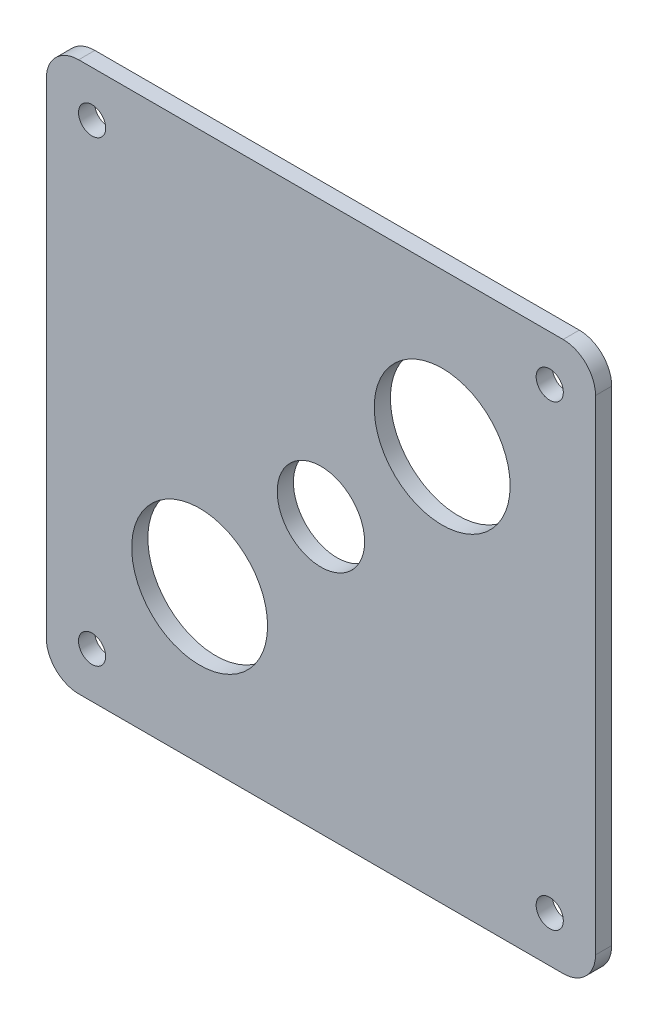
ISO-10303-21;
HEADER;
FILE_DESCRIPTION(('STEP AP214'),'2;1');
FILE_NAME('part.step','',(''),(''),'','','');
FILE_SCHEMA(('AUTOMOTIVE_DESIGN { 1 0 10303 214 1 1 1 1 }'));
ENDSEC;
DATA;
#1=APPLICATION_CONTEXT('core data for automotive mechanical design processes');
#2=APPLICATION_PROTOCOL_DEFINITION('international standard','automotive_design',2000,#1);
#3=PRODUCT_CONTEXT('',#1,'mechanical');
#4=PRODUCT('Part','Part','',(#3));
#5=PRODUCT_RELATED_PRODUCT_CATEGORY('part','',(#4));
#6=PRODUCT_DEFINITION_FORMATION('','',#4);
#7=PRODUCT_DEFINITION_CONTEXT('part definition',#1,'design');
#8=PRODUCT_DEFINITION('design','',#6,#7);
#9=PRODUCT_DEFINITION_SHAPE('','',#8);
#10=(LENGTH_UNIT() NAMED_UNIT(*) SI_UNIT(.MILLI.,.METRE.));
#11=(NAMED_UNIT(*) PLANE_ANGLE_UNIT() SI_UNIT($,.RADIAN.));
#12=(NAMED_UNIT(*) SI_UNIT($,.STERADIAN.) SOLID_ANGLE_UNIT());
#13=UNCERTAINTY_MEASURE_WITH_UNIT(LENGTH_MEASURE(1.E-05),#10,'distance_accuracy_value','');
#14=(GEOMETRIC_REPRESENTATION_CONTEXT(3) GLOBAL_UNCERTAINTY_ASSIGNED_CONTEXT((#13)) GLOBAL_UNIT_ASSIGNED_CONTEXT((#10,
#11,#12)) REPRESENTATION_CONTEXT('',''));
#15=CARTESIAN_POINT('',(0.,0.,0.));
#16=DIRECTION('',(0.,0.,1.));
#17=DIRECTION('',(1.,0.,0.));
#18=AXIS2_PLACEMENT_3D('',#15,#16,#17);
#19=CARTESIAN_POINT('',(-53.8815367264149,-53.8815367264149,3.175));
#20=DIRECTION('',(0.,1.,0.));
#21=DIRECTION('',(0.,0.,1.));
#22=AXIS2_PLACEMENT_3D('',#19,#20,#21);
#23=PLANE('',#22);
#24=DIRECTION('',(1.,0.,0.));
#25=VECTOR('',#24,1.);
#26=CARTESIAN_POINT('',(-53.8815367264149,-53.8815367264149,0.));
#27=LINE('',#26,#25);
#28=CARTESIAN_POINT('',(-47.5315367264149,-53.8815367264149,0.));
#29=VERTEX_POINT('',#28);
#30=CARTESIAN_POINT('',(47.5315367264149,-53.8815367264149,0.));
#31=VERTEX_POINT('',#30);
#32=EDGE_CURVE('E186',#29,#31,#27,.T.);
#33=ORIENTED_EDGE('',*,*,#32,.T.);
#34=DIRECTION('',(0.,0.,-1.));
#35=VECTOR('',#34,1.);
#36=CARTESIAN_POINT('',(47.5315367264149,-53.8815367264149,3.175));
#37=LINE('',#36,#35);
#38=CARTESIAN_POINT('',(47.5315367264149,-53.8815367264149,3.175));
#39=VERTEX_POINT('',#38);
#40=EDGE_CURVE('E11',#31,#39,#37,.F.);
#41=ORIENTED_EDGE('',*,*,#40,.T.);
#42=DIRECTION('',(1.,0.,0.));
#43=VECTOR('',#42,1.);
#44=CARTESIAN_POINT('',(-53.8815367264149,-53.8815367264149,3.175));
#45=LINE('',#44,#43);
#46=CARTESIAN_POINT('',(-47.5315367264149,-53.8815367264149,3.175));
#47=VERTEX_POINT('',#46);
#48=EDGE_CURVE('E189',#47,#39,#45,.T.);
#49=ORIENTED_EDGE('',*,*,#48,.F.);
#50=DIRECTION('',(0.,0.,-1.));
#51=VECTOR('',#50,1.);
#52=CARTESIAN_POINT('',(-47.5315367264149,-53.8815367264149,0.));
#53=LINE('',#52,#51);
#54=EDGE_CURVE('E50',#47,#29,#53,.T.);
#55=ORIENTED_EDGE('',*,*,#54,.T.);
#56=EDGE_LOOP('',(#33,#41,#49,#55));
#57=FACE_BOUND('',#56,.T.);
#58=ADVANCED_FACE('F41',(#57),#23,.F.);
#59=CARTESIAN_POINT('',(53.8815367264149,-53.8815367264149,3.175));
#60=DIRECTION('',(-1.,0.,0.));
#61=DIRECTION('',(0.,0.,1.));
#62=AXIS2_PLACEMENT_3D('',#59,#60,#61);
#63=PLANE('',#62);
#64=DIRECTION('',(0.,1.,0.));
#65=VECTOR('',#64,1.);
#66=CARTESIAN_POINT('',(53.8815367264149,-53.8815367264149,0.));
#67=LINE('',#66,#65);
#68=CARTESIAN_POINT('',(53.8815367264149,-47.5315367264149,0.));
#69=VERTEX_POINT('',#68);
#70=CARTESIAN_POINT('',(53.8815367264149,47.5315367264149,0.));
#71=VERTEX_POINT('',#70);
#72=EDGE_CURVE('E139',#69,#71,#67,.T.);
#73=ORIENTED_EDGE('',*,*,#72,.T.);
#74=DIRECTION('',(0.,0.,-1.));
#75=VECTOR('',#74,1.);
#76=CARTESIAN_POINT('',(53.8815367264149,47.5315367264149,3.175));
#77=LINE('',#76,#75);
#78=CARTESIAN_POINT('',(53.8815367264149,47.5315367264149,3.175));
#79=VERTEX_POINT('',#78);
#80=EDGE_CURVE('E162',#71,#79,#77,.F.);
#81=ORIENTED_EDGE('',*,*,#80,.T.);
#82=DIRECTION('',(0.,1.,0.));
#83=VECTOR('',#82,1.);
#84=CARTESIAN_POINT('',(53.8815367264149,-53.8815367264149,3.175));
#85=LINE('',#84,#83);
#86=CARTESIAN_POINT('',(53.8815367264149,-47.5315367264149,3.175));
#87=VERTEX_POINT('',#86);
#88=EDGE_CURVE('E208',#87,#79,#85,.T.);
#89=ORIENTED_EDGE('',*,*,#88,.F.);
#90=DIRECTION('',(0.,0.,-1.));
#91=VECTOR('',#90,1.);
#92=CARTESIAN_POINT('',(53.8815367264149,-47.5315367264149,3.175));
#93=LINE('',#92,#91);
#94=EDGE_CURVE('E159',#87,#69,#93,.T.);
#95=ORIENTED_EDGE('',*,*,#94,.T.);
#96=EDGE_LOOP('',(#73,#81,#89,#95));
#97=FACE_BOUND('',#96,.T.);
#98=ADVANCED_FACE('F290',(#97),#63,.F.);
#99=CARTESIAN_POINT('',(-53.8815367264149,53.8815367264149,3.175));
#100=DIRECTION('',(0.,1.,0.));
#101=DIRECTION('',(0.,0.,1.));
#102=AXIS2_PLACEMENT_3D('',#99,#100,#101);
#103=PLANE('',#102);
#104=DIRECTION('',(1.,0.,0.));
#105=VECTOR('',#104,1.);
#106=CARTESIAN_POINT('',(-53.8815367264149,53.8815367264149,3.175));
#107=LINE('',#106,#105);
#108=CARTESIAN_POINT('',(-47.5315367264149,53.8815367264149,3.175));
#109=VERTEX_POINT('',#108);
#110=CARTESIAN_POINT('',(47.5315367264149,53.8815367264149,3.175));
#111=VERTEX_POINT('',#110);
#112=EDGE_CURVE('E149',#109,#111,#107,.T.);
#113=ORIENTED_EDGE('',*,*,#112,.T.);
#114=DIRECTION('',(0.,0.,-1.));
#115=VECTOR('',#114,1.);
#116=CARTESIAN_POINT('',(47.5315367264149,53.8815367264149,0.));
#117=LINE('',#116,#115);
#118=CARTESIAN_POINT('',(47.5315367264149,53.8815367264149,0.));
#119=VERTEX_POINT('',#118);
#120=EDGE_CURVE('E137',#111,#119,#117,.T.);
#121=ORIENTED_EDGE('',*,*,#120,.T.);
#122=DIRECTION('',(1.,0.,0.));
#123=VECTOR('',#122,1.);
#124=CARTESIAN_POINT('',(-53.8815367264149,53.8815367264149,0.));
#125=LINE('',#124,#123);
#126=CARTESIAN_POINT('',(-47.5315367264149,53.8815367264149,0.));
#127=VERTEX_POINT('',#126);
#128=EDGE_CURVE('E121',#127,#119,#125,.T.);
#129=ORIENTED_EDGE('',*,*,#128,.F.);
#130=DIRECTION('',(0.,0.,-1.));
#131=VECTOR('',#130,1.);
#132=CARTESIAN_POINT('',(-47.5315367264149,53.8815367264149,3.175));
#133=LINE('',#132,#131);
#134=EDGE_CURVE('E135',#127,#109,#133,.F.);
#135=ORIENTED_EDGE('',*,*,#134,.T.);
#136=EDGE_LOOP('',(#113,#121,#129,#135));
#137=FACE_BOUND('',#136,.T.);
#138=ADVANCED_FACE('F134',(#137),#103,.T.);
#139=CARTESIAN_POINT('',(-53.8815367264149,-53.8815367264149,3.175));
#140=DIRECTION('',(-1.,0.,0.));
#141=DIRECTION('',(0.,0.,1.));
#142=AXIS2_PLACEMENT_3D('',#139,#140,#141);
#143=PLANE('',#142);
#144=DIRECTION('',(0.,1.,0.));
#145=VECTOR('',#144,1.);
#146=CARTESIAN_POINT('',(-53.8815367264149,-53.8815367264149,3.175));
#147=LINE('',#146,#145);
#148=CARTESIAN_POINT('',(-53.8815367264149,-47.5315367264149,3.175));
#149=VERTEX_POINT('',#148);
#150=CARTESIAN_POINT('',(-53.8815367264149,47.5315367264149,3.175));
#151=VERTEX_POINT('',#150);
#152=EDGE_CURVE('E143',#149,#151,#147,.T.);
#153=ORIENTED_EDGE('',*,*,#152,.T.);
#154=DIRECTION('',(0.,0.,-1.));
#155=VECTOR('',#154,1.);
#156=CARTESIAN_POINT('',(-53.8815367264149,47.5315367264149,3.175));
#157=LINE('',#156,#155);
#158=CARTESIAN_POINT('',(-53.8815367264149,47.5315367264149,0.));
#159=VERTEX_POINT('',#158);
#160=EDGE_CURVE('E176',#151,#159,#157,.T.);
#161=ORIENTED_EDGE('',*,*,#160,.T.);
#162=DIRECTION('',(0.,1.,0.));
#163=VECTOR('',#162,1.);
#164=CARTESIAN_POINT('',(-53.8815367264149,-53.8815367264149,0.));
#165=LINE('',#164,#163);
#166=CARTESIAN_POINT('',(-53.8815367264149,-47.5315367264149,0.));
#167=VERTEX_POINT('',#166);
#168=EDGE_CURVE('E122',#167,#159,#165,.T.);
#169=ORIENTED_EDGE('',*,*,#168,.F.);
#170=DIRECTION('',(0.,0.,-1.));
#171=VECTOR('',#170,1.);
#172=CARTESIAN_POINT('',(-53.8815367264149,-47.5315367264149,3.175));
#173=LINE('',#172,#171);
#174=EDGE_CURVE('E70',#167,#149,#173,.F.);
#175=ORIENTED_EDGE('',*,*,#174,.T.);
#176=EDGE_LOOP('',(#153,#161,#169,#175));
#177=FACE_BOUND('',#176,.T.);
#178=ADVANCED_FACE('F269',(#177),#143,.T.);
#179=CARTESIAN_POINT('',(0.,0.,3.175));
#180=DIRECTION('',(0.,0.,1.));
#181=DIRECTION('',(1.,0.,0.));
#182=AXIS2_PLACEMENT_3D('',#179,#180,#181);
#183=PLANE('',#182);
#184=CARTESIAN_POINT('',(23.7976787208319,23.7976787208346,3.175));
#185=DIRECTION('',(0.,0.,1.));
#186=DIRECTION('',(1.,0.,0.));
#187=AXIS2_PLACEMENT_3D('',#184,#185,#186);
#188=CIRCLE('',#187,13.335);
#189=CARTESIAN_POINT('',(37.1326787208319,23.7976787208346,3.175));
#190=VERTEX_POINT('',#189);
#191=EDGE_CURVE('E250',#190,#190,#188,.T.);
#192=ORIENTED_EDGE('',*,*,#191,.F.);
#193=EDGE_LOOP('',(#192));
#194=FACE_BOUND('',#193,.T.);
#195=CARTESIAN_POINT('',(-23.7976787208319,-23.7976787208346,3.175));
#196=DIRECTION('',(0.,0.,1.));
#197=DIRECTION('',(1.,0.,0.));
#198=AXIS2_PLACEMENT_3D('',#195,#196,#197);
#199=CIRCLE('',#198,13.335);
#200=CARTESIAN_POINT('',(-10.4626787208319,-23.7976787208346,3.175));
#201=VERTEX_POINT('',#200);
#202=EDGE_CURVE('E251',#201,#201,#199,.T.);
#203=ORIENTED_EDGE('',*,*,#202,.F.);
#204=EDGE_LOOP('',(#203));
#205=FACE_BOUND('',#204,.T.);
#206=CARTESIAN_POINT('',(44.9012806053473,44.9012806053425,3.175));
#207=DIRECTION('',(0.,0.,1.));
#208=DIRECTION('',(1.,0.,0.));
#209=AXIS2_PLACEMENT_3D('',#206,#207,#208);
#210=CIRCLE('',#209,2.665000004);
#211=CARTESIAN_POINT('',(47.5662806093473,44.9012806053425,3.175));
#212=VERTEX_POINT('',#211);
#213=EDGE_CURVE('E224',#212,#212,#210,.F.);
#214=ORIENTED_EDGE('',*,*,#213,.T.);
#215=EDGE_LOOP('',(#214));
#216=FACE_BOUND('',#215,.T.);
#217=CARTESIAN_POINT('',(44.9012806053477,-44.9012806053486,3.175));
#218=DIRECTION('',(0.,0.,1.));
#219=DIRECTION('',(1.,0.,0.));
#220=AXIS2_PLACEMENT_3D('',#217,#218,#219);
#221=CIRCLE('',#220,2.665000004);
#222=CARTESIAN_POINT('',(47.5662806093477,-44.9012806053486,3.175));
#223=VERTEX_POINT('',#222);
#224=EDGE_CURVE('E233',#223,#223,#221,.F.);
#225=ORIENTED_EDGE('',*,*,#224,.T.);
#226=EDGE_LOOP('',(#225));
#227=FACE_BOUND('',#226,.T.);
#228=CARTESIAN_POINT('',(-44.901280605344,-44.9012806053492,3.175));
#229=DIRECTION('',(0.,0.,1.));
#230=DIRECTION('',(1.,0.,0.));
#231=AXIS2_PLACEMENT_3D('',#228,#229,#230);
#232=CIRCLE('',#231,2.665000004);
#233=CARTESIAN_POINT('',(-42.236280601344,-44.9012806053492,3.175));
#234=VERTEX_POINT('',#233);
#235=EDGE_CURVE('E240',#234,#234,#232,.F.);
#236=ORIENTED_EDGE('',*,*,#235,.T.);
#237=EDGE_LOOP('',(#236));
#238=FACE_BOUND('',#237,.T.);
#239=CARTESIAN_POINT('',(-44.9012806053443,44.9012806053425,3.175));
#240=DIRECTION('',(0.,0.,1.));
#241=DIRECTION('',(1.,0.,0.));
#242=AXIS2_PLACEMENT_3D('',#239,#240,#241);
#243=CIRCLE('',#242,2.66500000399999);
#244=CARTESIAN_POINT('',(-42.2362806013443,44.9012806053425,3.175));
#245=VERTEX_POINT('',#244);
#246=EDGE_CURVE('E217',#245,#245,#243,.F.);
#247=ORIENTED_EDGE('',*,*,#246,.T.);
#248=EDGE_LOOP('',(#247));
#249=FACE_BOUND('',#248,.T.);
#250=CARTESIAN_POINT('',(0.,0.,3.175));
#251=DIRECTION('',(0.,0.,1.));
#252=DIRECTION('',(1.,0.,0.));
#253=AXIS2_PLACEMENT_3D('',#250,#251,#252);
#254=CIRCLE('',#253,8.5725);
#255=CARTESIAN_POINT('',(8.5725,0.,3.175));
#256=VERTEX_POINT('',#255);
#257=EDGE_CURVE('E203',#256,#256,#254,.T.);
#258=ORIENTED_EDGE('',*,*,#257,.F.);
#259=EDGE_LOOP('',(#258));
#260=FACE_BOUND('',#259,.T.);
#261=ORIENTED_EDGE('',*,*,#88,.T.);
#262=CARTESIAN_POINT('',(47.5315367264149,47.5315367264149,3.175));
#263=DIRECTION('',(0.,0.,1.));
#264=DIRECTION('',(1.,0.,0.));
#265=AXIS2_PLACEMENT_3D('',#262,#263,#264);
#266=CIRCLE('',#265,6.35);
#267=EDGE_CURVE('E172',#79,#111,#266,.T.);
#268=ORIENTED_EDGE('',*,*,#267,.T.);
#269=ORIENTED_EDGE('',*,*,#112,.F.);
#270=CARTESIAN_POINT('',(-47.5315367264149,47.5315367264149,3.175));
#271=DIRECTION('',(0.,0.,1.));
#272=DIRECTION('',(1.,0.,0.));
#273=AXIS2_PLACEMENT_3D('',#270,#271,#272);
#274=CIRCLE('',#273,6.35);
#275=EDGE_CURVE('E60',#109,#151,#274,.T.);
#276=ORIENTED_EDGE('',*,*,#275,.T.);
#277=ORIENTED_EDGE('',*,*,#152,.F.);
#278=CARTESIAN_POINT('',(-47.5315367264149,-47.5315367264149,3.175));
#279=DIRECTION('',(0.,0.,1.));
#280=DIRECTION('',(1.,0.,0.));
#281=AXIS2_PLACEMENT_3D('',#278,#279,#280);
#282=CIRCLE('',#281,6.35);
#283=EDGE_CURVE('E164',#149,#47,#282,.T.);
#284=ORIENTED_EDGE('',*,*,#283,.T.);
#285=ORIENTED_EDGE('',*,*,#48,.T.);
#286=CARTESIAN_POINT('',(47.5315367264149,-47.5315367264149,3.175));
#287=DIRECTION('',(0.,0.,1.));
#288=DIRECTION('',(1.,0.,0.));
#289=AXIS2_PLACEMENT_3D('',#286,#287,#288);
#290=CIRCLE('',#289,6.35);
#291=EDGE_CURVE('E167',#39,#87,#290,.T.);
#292=ORIENTED_EDGE('',*,*,#291,.T.);
#293=EDGE_LOOP('',(#261,#268,#269,#276,#277,#284,#285,#292));
#294=FACE_BOUND('',#293,.T.);
#295=ADVANCED_FACE('F266',(#194,#205,#216,#227,#238,#249,#260,#294),#183,.T.);
#296=CARTESIAN_POINT('',(0.,0.,0.));
#297=DIRECTION('',(0.,0.,1.));
#298=DIRECTION('',(1.,0.,0.));
#299=AXIS2_PLACEMENT_3D('',#296,#297,#298);
#300=PLANE('',#299);
#301=CARTESIAN_POINT('',(23.7976787208319,23.7976787208346,0.));
#302=DIRECTION('',(0.,0.,1.));
#303=DIRECTION('',(1.,0.,0.));
#304=AXIS2_PLACEMENT_3D('',#301,#302,#303);
#305=CIRCLE('',#304,13.335);
#306=CARTESIAN_POINT('',(37.1326787208319,23.7976787208346,0.));
#307=VERTEX_POINT('',#306);
#308=EDGE_CURVE('E229',#307,#307,#305,.F.);
#309=ORIENTED_EDGE('',*,*,#308,.F.);
#310=EDGE_LOOP('',(#309));
#311=FACE_BOUND('',#310,.T.);
#312=CARTESIAN_POINT('',(-23.7976787208319,-23.7976787208346,0.));
#313=DIRECTION('',(0.,0.,1.));
#314=DIRECTION('',(1.,0.,0.));
#315=AXIS2_PLACEMENT_3D('',#312,#313,#314);
#316=CIRCLE('',#315,13.335);
#317=CARTESIAN_POINT('',(-10.4626787208319,-23.7976787208346,0.));
#318=VERTEX_POINT('',#317);
#319=EDGE_CURVE('E246',#318,#318,#316,.F.);
#320=ORIENTED_EDGE('',*,*,#319,.F.);
#321=EDGE_LOOP('',(#320));
#322=FACE_BOUND('',#321,.T.);
#323=CARTESIAN_POINT('',(44.9012806053473,44.9012806053425,0.));
#324=DIRECTION('',(0.,0.,-1.));
#325=DIRECTION('',(-1.,0.,0.));
#326=AXIS2_PLACEMENT_3D('',#323,#324,#325);
#327=CIRCLE('',#326,2.665000004);
#328=CARTESIAN_POINT('',(42.2362806013473,44.9012806053425,0.));
#329=VERTEX_POINT('',#328);
#330=EDGE_CURVE('E228',#329,#329,#327,.T.);
#331=ORIENTED_EDGE('',*,*,#330,.F.);
#332=EDGE_LOOP('',(#331));
#333=FACE_BOUND('',#332,.T.);
#334=CARTESIAN_POINT('',(44.9012806053477,-44.9012806053486,0.));
#335=DIRECTION('',(0.,0.,-1.));
#336=DIRECTION('',(-1.,0.,0.));
#337=AXIS2_PLACEMENT_3D('',#334,#335,#336);
#338=CIRCLE('',#337,2.665000004);
#339=CARTESIAN_POINT('',(42.2362806013477,-44.9012806053486,0.));
#340=VERTEX_POINT('',#339);
#341=EDGE_CURVE('E237',#340,#340,#338,.T.);
#342=ORIENTED_EDGE('',*,*,#341,.F.);
#343=EDGE_LOOP('',(#342));
#344=FACE_BOUND('',#343,.T.);
#345=CARTESIAN_POINT('',(-44.901280605344,-44.9012806053492,0.));
#346=DIRECTION('',(0.,0.,-1.));
#347=DIRECTION('',(-1.,0.,0.));
#348=AXIS2_PLACEMENT_3D('',#345,#346,#347);
#349=CIRCLE('',#348,2.665000004);
#350=CARTESIAN_POINT('',(-47.566280609344,-44.9012806053492,0.));
#351=VERTEX_POINT('',#350);
#352=EDGE_CURVE('E220',#351,#351,#349,.T.);
#353=ORIENTED_EDGE('',*,*,#352,.F.);
#354=EDGE_LOOP('',(#353));
#355=FACE_BOUND('',#354,.T.);
#356=CARTESIAN_POINT('',(-44.9012806053443,44.9012806053425,0.));
#357=DIRECTION('',(0.,0.,-1.));
#358=DIRECTION('',(-1.,0.,0.));
#359=AXIS2_PLACEMENT_3D('',#356,#357,#358);
#360=CIRCLE('',#359,2.66500000399999);
#361=CARTESIAN_POINT('',(-47.5662806093443,44.9012806053425,0.));
#362=VERTEX_POINT('',#361);
#363=EDGE_CURVE('E216',#362,#362,#360,.T.);
#364=ORIENTED_EDGE('',*,*,#363,.F.);
#365=EDGE_LOOP('',(#364));
#366=FACE_BOUND('',#365,.T.);
#367=CARTESIAN_POINT('',(0.,0.,0.));
#368=DIRECTION('',(0.,0.,1.));
#369=DIRECTION('',(1.,0.,0.));
#370=AXIS2_PLACEMENT_3D('',#367,#368,#369);
#371=CIRCLE('',#370,8.5725);
#372=CARTESIAN_POINT('',(8.5725,0.,0.));
#373=VERTEX_POINT('',#372);
#374=EDGE_CURVE('E194',#373,#373,#371,.F.);
#375=ORIENTED_EDGE('',*,*,#374,.F.);
#376=EDGE_LOOP('',(#375));
#377=FACE_BOUND('',#376,.T.);
#378=ORIENTED_EDGE('',*,*,#128,.T.);
#379=CARTESIAN_POINT('',(47.5315367264149,47.5315367264149,0.));
#380=DIRECTION('',(0.,0.,1.));
#381=DIRECTION('',(1.,0.,0.));
#382=AXIS2_PLACEMENT_3D('',#379,#380,#381);
#383=CIRCLE('',#382,6.35);
#384=EDGE_CURVE('E128',#119,#71,#383,.F.);
#385=ORIENTED_EDGE('',*,*,#384,.T.);
#386=ORIENTED_EDGE('',*,*,#72,.F.);
#387=CARTESIAN_POINT('',(47.5315367264149,-47.5315367264149,0.));
#388=DIRECTION('',(0.,0.,1.));
#389=DIRECTION('',(1.,0.,0.));
#390=AXIS2_PLACEMENT_3D('',#387,#388,#389);
#391=CIRCLE('',#390,6.35);
#392=EDGE_CURVE('E129',#69,#31,#391,.F.);
#393=ORIENTED_EDGE('',*,*,#392,.T.);
#394=ORIENTED_EDGE('',*,*,#32,.F.);
#395=CARTESIAN_POINT('',(-47.5315367264149,-47.5315367264149,0.));
#396=DIRECTION('',(0.,0.,1.));
#397=DIRECTION('',(1.,0.,0.));
#398=AXIS2_PLACEMENT_3D('',#395,#396,#397);
#399=CIRCLE('',#398,6.35);
#400=EDGE_CURVE('E146',#29,#167,#399,.F.);
#401=ORIENTED_EDGE('',*,*,#400,.T.);
#402=ORIENTED_EDGE('',*,*,#168,.T.);
#403=CARTESIAN_POINT('',(-47.5315367264149,47.5315367264149,0.));
#404=DIRECTION('',(0.,0.,1.));
#405=DIRECTION('',(1.,0.,0.));
#406=AXIS2_PLACEMENT_3D('',#403,#404,#405);
#407=CIRCLE('',#406,6.35);
#408=EDGE_CURVE('E118',#159,#127,#407,.F.);
#409=ORIENTED_EDGE('',*,*,#408,.T.);
#410=EDGE_LOOP('',(#378,#385,#386,#393,#394,#401,#402,#409));
#411=FACE_BOUND('',#410,.T.);
#412=ADVANCED_FACE('F120',(#311,#322,#333,#344,#355,#366,#377,#411),#300,.F.);
#413=CARTESIAN_POINT('',(0.,0.,-0.00100000000000013));
#414=DIRECTION('',(0.,0.,1.));
#415=DIRECTION('',(1.,0.,0.));
#416=AXIS2_PLACEMENT_3D('',#413,#414,#415);
#417=CYLINDRICAL_SURFACE('',#416,8.5725);
#418=ORIENTED_EDGE('',*,*,#257,.T.);
#419=EDGE_LOOP('',(#418));
#420=FACE_BOUND('',#419,.T.);
#421=ORIENTED_EDGE('',*,*,#374,.T.);
#422=EDGE_LOOP('',(#421));
#423=FACE_BOUND('',#422,.T.);
#424=ADVANCED_FACE('F313',(#420,#423),#417,.F.);
#425=CARTESIAN_POINT('',(47.5315367264149,47.5315367264149,3.175));
#426=DIRECTION('',(0.,0.,1.));
#427=DIRECTION('',(1.,0.,0.));
#428=AXIS2_PLACEMENT_3D('',#425,#426,#427);
#429=CYLINDRICAL_SURFACE('',#428,6.35);
#430=ORIENTED_EDGE('',*,*,#267,.F.);
#431=ORIENTED_EDGE('',*,*,#80,.F.);
#432=ORIENTED_EDGE('',*,*,#384,.F.);
#433=ORIENTED_EDGE('',*,*,#120,.F.);
#434=EDGE_LOOP('',(#430,#431,#432,#433));
#435=FACE_BOUND('',#434,.T.);
#436=ADVANCED_FACE('F289',(#435),#429,.T.);
#437=CARTESIAN_POINT('',(-47.5315367264149,47.5315367264149,3.175));
#438=DIRECTION('',(0.,0.,-1.));
#439=DIRECTION('',(-1.,0.,0.));
#440=AXIS2_PLACEMENT_3D('',#437,#438,#439);
#441=CYLINDRICAL_SURFACE('',#440,6.35);
#442=ORIENTED_EDGE('',*,*,#275,.F.);
#443=ORIENTED_EDGE('',*,*,#134,.F.);
#444=ORIENTED_EDGE('',*,*,#408,.F.);
#445=ORIENTED_EDGE('',*,*,#160,.F.);
#446=EDGE_LOOP('',(#442,#443,#444,#445));
#447=FACE_BOUND('',#446,.T.);
#448=ADVANCED_FACE('F141',(#447),#441,.T.);
#449=CARTESIAN_POINT('',(47.5315367264149,-47.5315367264149,3.175));
#450=DIRECTION('',(0.,0.,-1.));
#451=DIRECTION('',(-1.,0.,0.));
#452=AXIS2_PLACEMENT_3D('',#449,#450,#451);
#453=CYLINDRICAL_SURFACE('',#452,6.35);
#454=ORIENTED_EDGE('',*,*,#291,.F.);
#455=ORIENTED_EDGE('',*,*,#40,.F.);
#456=ORIENTED_EDGE('',*,*,#392,.F.);
#457=ORIENTED_EDGE('',*,*,#94,.F.);
#458=EDGE_LOOP('',(#454,#455,#456,#457));
#459=FACE_BOUND('',#458,.T.);
#460=ADVANCED_FACE('F292',(#459),#453,.T.);
#461=CARTESIAN_POINT('',(-47.5315367264149,-47.5315367264149,3.175));
#462=DIRECTION('',(0.,0.,1.));
#463=DIRECTION('',(1.,0.,0.));
#464=AXIS2_PLACEMENT_3D('',#461,#462,#463);
#465=CYLINDRICAL_SURFACE('',#464,6.35);
#466=ORIENTED_EDGE('',*,*,#283,.F.);
#467=ORIENTED_EDGE('',*,*,#174,.F.);
#468=ORIENTED_EDGE('',*,*,#400,.F.);
#469=ORIENTED_EDGE('',*,*,#54,.F.);
#470=EDGE_LOOP('',(#466,#467,#468,#469));
#471=FACE_BOUND('',#470,.T.);
#472=ADVANCED_FACE('F43',(#471),#465,.T.);
#473=CARTESIAN_POINT('',(-44.9012806053443,44.9012806053425,3.176));
#474=DIRECTION('',(0.,0.,-1.));
#475=DIRECTION('',(-1.,0.,0.));
#476=AXIS2_PLACEMENT_3D('',#473,#474,#475);
#477=CYLINDRICAL_SURFACE('',#476,2.66500000399999);
#478=ORIENTED_EDGE('',*,*,#246,.F.);
#479=EDGE_LOOP('',(#478));
#480=FACE_BOUND('',#479,.T.);
#481=ORIENTED_EDGE('',*,*,#363,.T.);
#482=EDGE_LOOP('',(#481));
#483=FACE_BOUND('',#482,.T.);
#484=ADVANCED_FACE('F294',(#480,#483),#477,.F.);
#485=CARTESIAN_POINT('',(-44.901280605344,-44.9012806053492,3.176));
#486=DIRECTION('',(0.,0.,-1.));
#487=DIRECTION('',(-1.,0.,0.));
#488=AXIS2_PLACEMENT_3D('',#485,#486,#487);
#489=CYLINDRICAL_SURFACE('',#488,2.665000004);
#490=ORIENTED_EDGE('',*,*,#235,.F.);
#491=EDGE_LOOP('',(#490));
#492=FACE_BOUND('',#491,.T.);
#493=ORIENTED_EDGE('',*,*,#352,.T.);
#494=EDGE_LOOP('',(#493));
#495=FACE_BOUND('',#494,.T.);
#496=ADVANCED_FACE('F299',(#492,#495),#489,.F.);
#497=CARTESIAN_POINT('',(44.9012806053477,-44.9012806053486,3.176));
#498=DIRECTION('',(0.,0.,-1.));
#499=DIRECTION('',(-1.,0.,0.));
#500=AXIS2_PLACEMENT_3D('',#497,#498,#499);
#501=CYLINDRICAL_SURFACE('',#500,2.665000004);
#502=ORIENTED_EDGE('',*,*,#224,.F.);
#503=EDGE_LOOP('',(#502));
#504=FACE_BOUND('',#503,.T.);
#505=ORIENTED_EDGE('',*,*,#341,.T.);
#506=EDGE_LOOP('',(#505));
#507=FACE_BOUND('',#506,.T.);
#508=ADVANCED_FACE('F343',(#504,#507),#501,.F.);
#509=CARTESIAN_POINT('',(44.9012806053473,44.9012806053425,3.176));
#510=DIRECTION('',(0.,0.,-1.));
#511=DIRECTION('',(-1.,0.,0.));
#512=AXIS2_PLACEMENT_3D('',#509,#510,#511);
#513=CYLINDRICAL_SURFACE('',#512,2.665000004);
#514=ORIENTED_EDGE('',*,*,#213,.F.);
#515=EDGE_LOOP('',(#514));
#516=FACE_BOUND('',#515,.T.);
#517=ORIENTED_EDGE('',*,*,#330,.T.);
#518=EDGE_LOOP('',(#517));
#519=FACE_BOUND('',#518,.T.);
#520=ADVANCED_FACE('F353',(#516,#519),#513,.F.);
#521=CARTESIAN_POINT('',(-23.7976787208319,-23.7976787208346,-0.00100000000000013));
#522=DIRECTION('',(0.,0.,1.));
#523=DIRECTION('',(1.,0.,0.));
#524=AXIS2_PLACEMENT_3D('',#521,#522,#523);
#525=CYLINDRICAL_SURFACE('',#524,13.335);
#526=ORIENTED_EDGE('',*,*,#202,.T.);
#527=EDGE_LOOP('',(#526));
#528=FACE_BOUND('',#527,.T.);
#529=ORIENTED_EDGE('',*,*,#319,.T.);
#530=EDGE_LOOP('',(#529));
#531=FACE_BOUND('',#530,.T.);
#532=ADVANCED_FACE('F363',(#528,#531),#525,.F.);
#533=CARTESIAN_POINT('',(23.7976787208319,23.7976787208346,-0.00100000000000013));
#534=DIRECTION('',(0.,0.,1.));
#535=DIRECTION('',(1.,0.,0.));
#536=AXIS2_PLACEMENT_3D('',#533,#534,#535);
#537=CYLINDRICAL_SURFACE('',#536,13.335);
#538=ORIENTED_EDGE('',*,*,#191,.T.);
#539=EDGE_LOOP('',(#538));
#540=FACE_BOUND('',#539,.T.);
#541=ORIENTED_EDGE('',*,*,#308,.T.);
#542=EDGE_LOOP('',(#541));
#543=FACE_BOUND('',#542,.T.);
#544=ADVANCED_FACE('F263',(#540,#543),#537,.F.);
#545=CLOSED_SHELL('',(#58,#98,#138,#178,#295,#412,#424,#436,#448,#460,#472,#484,#496,#508,#520,
#532,#544));
#546=MANIFOLD_SOLID_BREP('B2',#545);
#547=ADVANCED_BREP_SHAPE_REPRESENTATION('',(#18,#546),#14);
#548=SHAPE_DEFINITION_REPRESENTATION(#9,#547);
ENDSEC;
END-ISO-10303-21;
